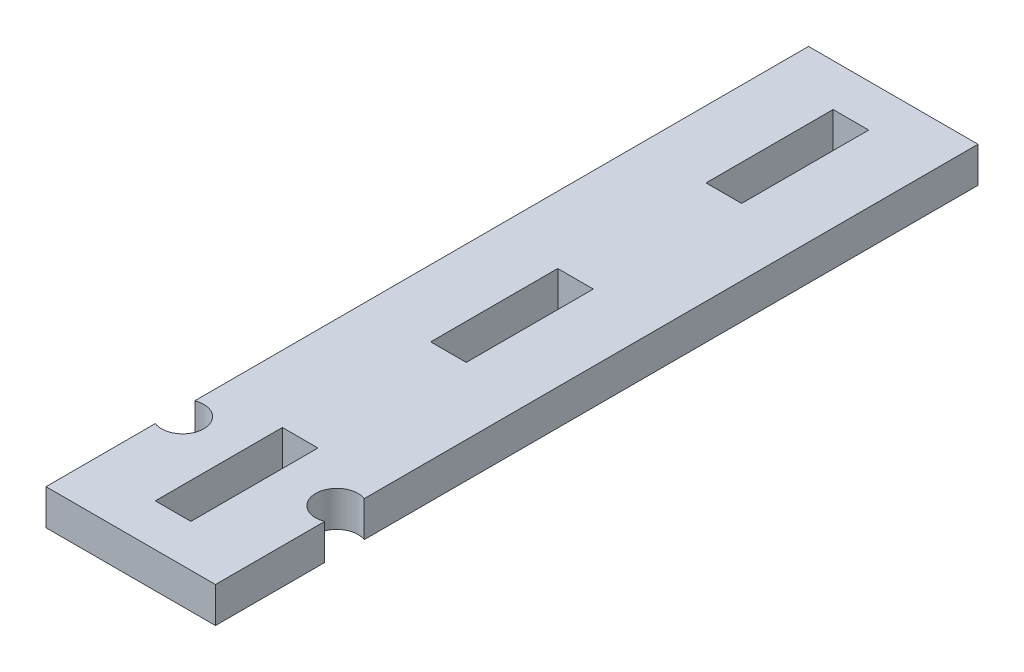
ISO-10303-21;
HEADER;
FILE_DESCRIPTION(('STEP AP214'),'2;1');
FILE_NAME('part.step','',(''),(''),'','','');
FILE_SCHEMA(('AUTOMOTIVE_DESIGN { 1 0 10303 214 1 1 1 1 }'));
ENDSEC;
DATA;
#1=APPLICATION_CONTEXT('core data for automotive mechanical design processes');
#2=APPLICATION_PROTOCOL_DEFINITION('international standard','automotive_design',2000,#1);
#3=PRODUCT_CONTEXT('',#1,'mechanical');
#4=PRODUCT('Part','Part','',(#3));
#5=PRODUCT_RELATED_PRODUCT_CATEGORY('part','',(#4));
#6=PRODUCT_DEFINITION_FORMATION('','',#4);
#7=PRODUCT_DEFINITION_CONTEXT('part definition',#1,'design');
#8=PRODUCT_DEFINITION('design','',#6,#7);
#9=PRODUCT_DEFINITION_SHAPE('','',#8);
#10=(LENGTH_UNIT() NAMED_UNIT(*) SI_UNIT(.MILLI.,.METRE.));
#11=(NAMED_UNIT(*) PLANE_ANGLE_UNIT() SI_UNIT($,.RADIAN.));
#12=(NAMED_UNIT(*) SI_UNIT($,.STERADIAN.) SOLID_ANGLE_UNIT());
#13=UNCERTAINTY_MEASURE_WITH_UNIT(LENGTH_MEASURE(1.E-05),#10,'distance_accuracy_value','');
#14=(GEOMETRIC_REPRESENTATION_CONTEXT(3) GLOBAL_UNCERTAINTY_ASSIGNED_CONTEXT((#13)) GLOBAL_UNIT_ASSIGNED_CONTEXT((#10,
#11,#12)) REPRESENTATION_CONTEXT('',''));
#15=CARTESIAN_POINT('',(0.,0.,0.));
#16=DIRECTION('',(0.,0.,1.));
#17=DIRECTION('',(1.,0.,0.));
#18=AXIS2_PLACEMENT_3D('',#15,#16,#17);
#19=CARTESIAN_POINT('',(25.4,5.334,0.));
#20=DIRECTION('',(-1.,0.,0.));
#21=DIRECTION('',(0.,0.,1.));
#22=AXIS2_PLACEMENT_3D('',#19,#20,#21);
#23=PLANE('',#22);
#24=DIRECTION('',(0.,0.,-1.));
#25=VECTOR('',#24,1.);
#26=CARTESIAN_POINT('',(25.4,5.334,0.));
#27=LINE('',#26,#25);
#28=CARTESIAN_POINT('',(25.4,5.334,-22.2990988577116));
#29=VERTEX_POINT('',#28);
#30=CARTESIAN_POINT('',(25.4,5.334,-114.3));
#31=VERTEX_POINT('',#30);
#32=EDGE_CURVE('E182',#29,#31,#27,.T.);
#33=ORIENTED_EDGE('',*,*,#32,.F.);
#34=DIRECTION('',(0.,-1.,0.));
#35=VECTOR('',#34,1.);
#36=CARTESIAN_POINT('',(25.4,5.334,-22.2990988577116));
#37=LINE('',#36,#35);
#38=CARTESIAN_POINT('',(25.4,0.,-22.2990988577116));
#39=VERTEX_POINT('',#38);
#40=EDGE_CURVE('E170',#29,#39,#37,.T.);
#41=ORIENTED_EDGE('',*,*,#40,.T.);
#42=DIRECTION('',(0.,0.,-1.));
#43=VECTOR('',#42,1.);
#44=CARTESIAN_POINT('',(25.4,0.,0.));
#45=LINE('',#44,#43);
#46=CARTESIAN_POINT('',(25.4,0.,-114.3));
#47=VERTEX_POINT('',#46);
#48=EDGE_CURVE('E205',#39,#47,#45,.T.);
#49=ORIENTED_EDGE('',*,*,#48,.T.);
#50=DIRECTION('',(0.,-1.,0.));
#51=VECTOR('',#50,1.);
#52=CARTESIAN_POINT('',(25.4,5.334,-114.3));
#53=LINE('',#52,#51);
#54=EDGE_CURVE('E188',#31,#47,#53,.T.);
#55=ORIENTED_EDGE('',*,*,#54,.F.);
#56=EDGE_LOOP('',(#33,#41,#49,#55));
#57=FACE_BOUND('',#56,.T.);
#58=ADVANCED_FACE('F36',(#57),#23,.F.);
#59=CARTESIAN_POINT('',(0.,5.334,0.));
#60=DIRECTION('',(1.,0.,0.));
#61=DIRECTION('',(0.,0.,-1.));
#62=AXIS2_PLACEMENT_3D('',#59,#60,#61);
#63=PLANE('',#62);
#64=DIRECTION('',(0.,0.,1.));
#65=VECTOR('',#64,1.);
#66=CARTESIAN_POINT('',(0.,5.334,0.));
#67=LINE('',#66,#65);
#68=CARTESIAN_POINT('',(0.,5.334,-16.3748517325479));
#69=VERTEX_POINT('',#68);
#70=CARTESIAN_POINT('',(0.,5.334,0.));
#71=VERTEX_POINT('',#70);
#72=EDGE_CURVE('E211',#69,#71,#67,.T.);
#73=ORIENTED_EDGE('',*,*,#72,.F.);
#74=DIRECTION('',(0.,-1.,0.));
#75=VECTOR('',#74,1.);
#76=CARTESIAN_POINT('',(0.,5.334,-16.3748517325479));
#77=LINE('',#76,#75);
#78=CARTESIAN_POINT('',(0.,0.,-16.3748517325479));
#79=VERTEX_POINT('',#78);
#80=EDGE_CURVE('E222',#69,#79,#77,.T.);
#81=ORIENTED_EDGE('',*,*,#80,.T.);
#82=DIRECTION('',(0.,0.,1.));
#83=VECTOR('',#82,1.);
#84=CARTESIAN_POINT('',(0.,0.,0.));
#85=LINE('',#84,#83);
#86=CARTESIAN_POINT('',(0.,0.,0.));
#87=VERTEX_POINT('',#86);
#88=EDGE_CURVE('E203',#79,#87,#85,.T.);
#89=ORIENTED_EDGE('',*,*,#88,.T.);
#90=DIRECTION('',(0.,-1.,0.));
#91=VECTOR('',#90,1.);
#92=CARTESIAN_POINT('',(0.,5.334,0.));
#93=LINE('',#92,#91);
#94=EDGE_CURVE('E218',#71,#87,#93,.T.);
#95=ORIENTED_EDGE('',*,*,#94,.F.);
#96=EDGE_LOOP('',(#73,#81,#89,#95));
#97=FACE_BOUND('',#96,.T.);
#98=ADVANCED_FACE('F229',(#97),#63,.F.);
#99=CARTESIAN_POINT('',(0.,0.,-114.3));
#100=VERTEX_POINT('',#99);
#101=CARTESIAN_POINT('',(0.,0.,-22.2990988577108));
#102=VERTEX_POINT('',#101);
#103=EDGE_CURVE('E199',#100,#102,#85,.T.);
#104=ORIENTED_EDGE('',*,*,#103,.T.);
#105=DIRECTION('',(0.,-1.,0.));
#106=VECTOR('',#105,1.);
#107=CARTESIAN_POINT('',(0.,5.334,-22.2990988577108));
#108=LINE('',#107,#106);
#109=CARTESIAN_POINT('',(0.,5.334,-22.2990988577108));
#110=VERTEX_POINT('',#109);
#111=EDGE_CURVE('E58',#102,#110,#108,.F.);
#112=ORIENTED_EDGE('',*,*,#111,.T.);
#113=CARTESIAN_POINT('',(0.,5.334,-114.3));
#114=VERTEX_POINT('',#113);
#115=EDGE_CURVE('E193',#114,#110,#67,.T.);
#116=ORIENTED_EDGE('',*,*,#115,.F.);
#117=DIRECTION('',(0.,-1.,0.));
#118=VECTOR('',#117,1.);
#119=CARTESIAN_POINT('',(0.,5.334,-114.3));
#120=LINE('',#119,#118);
#121=EDGE_CURVE('E198',#114,#100,#120,.T.);
#122=ORIENTED_EDGE('',*,*,#121,.T.);
#123=EDGE_LOOP('',(#104,#112,#116,#122));
#124=FACE_BOUND('',#123,.T.);
#125=ADVANCED_FACE('F38',(#124),#63,.F.);
#126=CARTESIAN_POINT('',(0.,5.334,0.));
#127=DIRECTION('',(0.,0.,-1.));
#128=DIRECTION('',(-1.,0.,0.));
#129=AXIS2_PLACEMENT_3D('',#126,#127,#128);
#130=PLANE('',#129);
#131=DIRECTION('',(1.,0.,0.));
#132=VECTOR('',#131,1.);
#133=CARTESIAN_POINT('',(0.,0.,0.));
#134=LINE('',#133,#132);
#135=CARTESIAN_POINT('',(25.4,0.,0.));
#136=VERTEX_POINT('',#135);
#137=EDGE_CURVE('E202',#87,#136,#134,.T.);
#138=ORIENTED_EDGE('',*,*,#137,.T.);
#139=DIRECTION('',(0.,-1.,0.));
#140=VECTOR('',#139,1.);
#141=CARTESIAN_POINT('',(25.4,5.334,0.));
#142=LINE('',#141,#140);
#143=CARTESIAN_POINT('',(25.4,5.334,0.));
#144=VERTEX_POINT('',#143);
#145=EDGE_CURVE('E215',#144,#136,#142,.T.);
#146=ORIENTED_EDGE('',*,*,#145,.F.);
#147=DIRECTION('',(1.,0.,0.));
#148=VECTOR('',#147,1.);
#149=CARTESIAN_POINT('',(0.,5.334,0.));
#150=LINE('',#149,#148);
#151=EDGE_CURVE('E190',#71,#144,#150,.T.);
#152=ORIENTED_EDGE('',*,*,#151,.F.);
#153=ORIENTED_EDGE('',*,*,#94,.T.);
#154=EDGE_LOOP('',(#138,#146,#152,#153));
#155=FACE_BOUND('',#154,.T.);
#156=ADVANCED_FACE('F258',(#155),#130,.F.);
#157=CARTESIAN_POINT('',(25.4,0.,-16.3748517325489));
#158=VERTEX_POINT('',#157);
#159=EDGE_CURVE('E206',#136,#158,#45,.T.);
#160=ORIENTED_EDGE('',*,*,#159,.T.);
#161=DIRECTION('',(0.,-1.,0.));
#162=VECTOR('',#161,1.);
#163=CARTESIAN_POINT('',(25.4,5.334,-16.3748517325489));
#164=LINE('',#163,#162);
#165=CARTESIAN_POINT('',(25.4,5.334,-16.3748517325489));
#166=VERTEX_POINT('',#165);
#167=EDGE_CURVE('E50',#158,#166,#164,.F.);
#168=ORIENTED_EDGE('',*,*,#167,.T.);
#169=EDGE_CURVE('E185',#144,#166,#27,.T.);
#170=ORIENTED_EDGE('',*,*,#169,.F.);
#171=ORIENTED_EDGE('',*,*,#145,.T.);
#172=EDGE_LOOP('',(#160,#168,#170,#171));
#173=FACE_BOUND('',#172,.T.);
#174=ADVANCED_FACE('F260',(#173),#23,.F.);
#175=CARTESIAN_POINT('',(0.,5.334,-114.3));
#176=DIRECTION('',(0.,0.,1.));
#177=DIRECTION('',(1.,0.,0.));
#178=AXIS2_PLACEMENT_3D('',#175,#176,#177);
#179=PLANE('',#178);
#180=DIRECTION('',(-1.,0.,0.));
#181=VECTOR('',#180,1.);
#182=CARTESIAN_POINT('',(0.,0.,-114.3));
#183=LINE('',#182,#181);
#184=EDGE_CURVE('E209',#47,#100,#183,.T.);
#185=ORIENTED_EDGE('',*,*,#184,.T.);
#186=ORIENTED_EDGE('',*,*,#121,.F.);
#187=DIRECTION('',(-1.,0.,0.));
#188=VECTOR('',#187,1.);
#189=CARTESIAN_POINT('',(0.,5.334,-114.3));
#190=LINE('',#189,#188);
#191=EDGE_CURVE('E192',#31,#114,#190,.T.);
#192=ORIENTED_EDGE('',*,*,#191,.F.);
#193=ORIENTED_EDGE('',*,*,#54,.T.);
#194=EDGE_LOOP('',(#185,#186,#192,#193));
#195=FACE_BOUND('',#194,.T.);
#196=ADVANCED_FACE('F378',(#195),#179,.F.);
#197=CARTESIAN_POINT('',(0.,5.334,0.));
#198=DIRECTION('',(0.,-1.,0.));
#199=DIRECTION('',(0.,0.,-1.));
#200=AXIS2_PLACEMENT_3D('',#197,#198,#199);
#201=PLANE('',#200);
#202=DIRECTION('',(1.,0.,0.));
#203=VECTOR('',#202,1.);
#204=CARTESIAN_POINT('',(10.0329999999915,5.334,-25.4000000000032));
#205=LINE('',#204,#203);
#206=CARTESIAN_POINT('',(10.0329999999915,5.334,-25.4000000000032));
#207=VERTEX_POINT('',#206);
#208=CARTESIAN_POINT('',(15.3669999999915,5.334,-25.4000000000032));
#209=VERTEX_POINT('',#208);
#210=EDGE_CURVE('E275',#207,#209,#205,.T.);
#211=ORIENTED_EDGE('',*,*,#210,.T.);
#212=DIRECTION('',(0.,0.,1.));
#213=VECTOR('',#212,1.);
#214=CARTESIAN_POINT('',(15.3669999999915,5.334,-25.4000000000032));
#215=LINE('',#214,#213);
#216=CARTESIAN_POINT('',(15.3669999999914,5.334,-6.35000000000316));
#217=VERTEX_POINT('',#216);
#218=EDGE_CURVE('E265',#209,#217,#215,.T.);
#219=ORIENTED_EDGE('',*,*,#218,.T.);
#220=DIRECTION('',(-1.,0.,0.));
#221=VECTOR('',#220,1.);
#222=CARTESIAN_POINT('',(15.3669999999914,5.334,-6.35000000000316));
#223=LINE('',#222,#221);
#224=CARTESIAN_POINT('',(10.0329999999914,5.334,-6.35000000000317));
#225=VERTEX_POINT('',#224);
#226=EDGE_CURVE('E268',#217,#225,#223,.T.);
#227=ORIENTED_EDGE('',*,*,#226,.T.);
#228=DIRECTION('',(0.,0.,-1.));
#229=VECTOR('',#228,1.);
#230=CARTESIAN_POINT('',(10.0329999999914,5.334,-6.35000000000317));
#231=LINE('',#230,#229);
#232=EDGE_CURVE('E272',#225,#207,#231,.T.);
#233=ORIENTED_EDGE('',*,*,#232,.T.);
#234=EDGE_LOOP('',(#211,#219,#227,#233));
#235=FACE_BOUND('',#234,.T.);
#236=DIRECTION('',(-1.,0.,0.));
#237=VECTOR('',#236,1.);
#238=CARTESIAN_POINT('',(15.3669999999916,5.334,-47.6250000000032));
#239=LINE('',#238,#237);
#240=CARTESIAN_POINT('',(15.3669999999916,5.334,-47.6250000000032));
#241=VERTEX_POINT('',#240);
#242=CARTESIAN_POINT('',(10.0329999999916,5.334,-47.6250000000032));
#243=VERTEX_POINT('',#242);
#244=EDGE_CURVE('E307',#241,#243,#239,.T.);
#245=ORIENTED_EDGE('',*,*,#244,.T.);
#246=DIRECTION('',(0.,0.,-1.));
#247=VECTOR('',#246,1.);
#248=CARTESIAN_POINT('',(10.0329999999916,5.334,-47.6250000000032));
#249=LINE('',#248,#247);
#250=CARTESIAN_POINT('',(10.0329999999917,5.334,-66.6750000000032));
#251=VERTEX_POINT('',#250);
#252=EDGE_CURVE('E297',#243,#251,#249,.T.);
#253=ORIENTED_EDGE('',*,*,#252,.T.);
#254=DIRECTION('',(1.,0.,0.));
#255=VECTOR('',#254,1.);
#256=CARTESIAN_POINT('',(10.0329999999917,5.334,-66.6750000000032));
#257=LINE('',#256,#255);
#258=CARTESIAN_POINT('',(15.3669999999917,5.334,-66.6750000000032));
#259=VERTEX_POINT('',#258);
#260=EDGE_CURVE('E300',#251,#259,#257,.T.);
#261=ORIENTED_EDGE('',*,*,#260,.T.);
#262=DIRECTION('',(0.,0.,1.));
#263=VECTOR('',#262,1.);
#264=CARTESIAN_POINT('',(15.3669999999917,5.334,-66.6750000000032));
#265=LINE('',#264,#263);
#266=EDGE_CURVE('E304',#259,#241,#265,.T.);
#267=ORIENTED_EDGE('',*,*,#266,.T.);
#268=EDGE_LOOP('',(#245,#253,#261,#267));
#269=FACE_BOUND('',#268,.T.);
#270=DIRECTION('',(-1.,0.,0.));
#271=VECTOR('',#270,1.);
#272=CARTESIAN_POINT('',(15.3669999999917,5.334,-88.9000000000032));
#273=LINE('',#272,#271);
#274=CARTESIAN_POINT('',(15.3669999999917,5.334,-88.9000000000032));
#275=VERTEX_POINT('',#274);
#276=CARTESIAN_POINT('',(10.0329999999917,5.334,-88.9000000000032));
#277=VERTEX_POINT('',#276);
#278=EDGE_CURVE('E252',#275,#277,#273,.T.);
#279=ORIENTED_EDGE('',*,*,#278,.T.);
#280=DIRECTION('',(0.,0.,-1.));
#281=VECTOR('',#280,1.);
#282=CARTESIAN_POINT('',(10.0329999999917,5.334,-88.9000000000032));
#283=LINE('',#282,#281);
#284=CARTESIAN_POINT('',(10.0329999999918,5.334,-107.950000000003));
#285=VERTEX_POINT('',#284);
#286=EDGE_CURVE('E329',#277,#285,#283,.T.);
#287=ORIENTED_EDGE('',*,*,#286,.T.);
#288=DIRECTION('',(1.,0.,0.));
#289=VECTOR('',#288,1.);
#290=CARTESIAN_POINT('',(10.0329999999918,5.334,-107.950000000003));
#291=LINE('',#290,#289);
#292=CARTESIAN_POINT('',(15.3669999999918,5.334,-107.950000000003));
#293=VERTEX_POINT('',#292);
#294=EDGE_CURVE('E332',#285,#293,#291,.T.);
#295=ORIENTED_EDGE('',*,*,#294,.T.);
#296=DIRECTION('',(0.,0.,1.));
#297=VECTOR('',#296,1.);
#298=CARTESIAN_POINT('',(15.3669999999918,5.334,-107.950000000003));
#299=LINE('',#298,#297);
#300=EDGE_CURVE('E335',#293,#275,#299,.T.);
#301=ORIENTED_EDGE('',*,*,#300,.T.);
#302=EDGE_LOOP('',(#279,#287,#295,#301));
#303=FACE_BOUND('',#302,.T.);
#304=ORIENTED_EDGE('',*,*,#169,.T.);
#305=CARTESIAN_POINT('',(24.2569999999998,5.334,-19.3369752951302));
#306=DIRECTION('',(0.,-1.,0.));
#307=DIRECTION('',(0.,0.,-1.));
#308=AXIS2_PLACEMENT_3D('',#305,#306,#307);
#309=CIRCLE('',#308,3.175);
#310=EDGE_CURVE('E173',#166,#29,#309,.T.);
#311=ORIENTED_EDGE('',*,*,#310,.T.);
#312=ORIENTED_EDGE('',*,*,#32,.T.);
#313=ORIENTED_EDGE('',*,*,#191,.T.);
#314=ORIENTED_EDGE('',*,*,#115,.T.);
#315=CARTESIAN_POINT('',(1.14299999999988,5.334,-19.3369752951293));
#316=DIRECTION('',(0.,-1.,0.));
#317=DIRECTION('',(0.,0.,1.));
#318=AXIS2_PLACEMENT_3D('',#315,#316,#317);
#319=CIRCLE('',#318,3.175);
#320=EDGE_CURVE('E177',#110,#69,#319,.T.);
#321=ORIENTED_EDGE('',*,*,#320,.T.);
#322=ORIENTED_EDGE('',*,*,#72,.T.);
#323=ORIENTED_EDGE('',*,*,#151,.T.);
#324=EDGE_LOOP('',(#304,#311,#312,#313,#314,#321,#322,#323));
#325=FACE_BOUND('',#324,.T.);
#326=ADVANCED_FACE('F181',(#235,#269,#303,#325),#201,.F.);
#327=CARTESIAN_POINT('',(0.,0.,0.));
#328=DIRECTION('',(0.,-1.,0.));
#329=DIRECTION('',(0.,0.,-1.));
#330=AXIS2_PLACEMENT_3D('',#327,#328,#329);
#331=PLANE('',#330);
#332=CARTESIAN_POINT('',(24.2569999999998,0.,-19.3369752951302));
#333=DIRECTION('',(0.,-1.,0.));
#334=DIRECTION('',(0.,0.,-1.));
#335=AXIS2_PLACEMENT_3D('',#332,#333,#334);
#336=CIRCLE('',#335,3.175);
#337=EDGE_CURVE('E12',#158,#39,#336,.T.);
#338=ORIENTED_EDGE('',*,*,#337,.F.);
#339=ORIENTED_EDGE('',*,*,#159,.F.);
#340=ORIENTED_EDGE('',*,*,#137,.F.);
#341=ORIENTED_EDGE('',*,*,#88,.F.);
#342=CARTESIAN_POINT('',(1.14299999999988,0.,-19.3369752951293));
#343=DIRECTION('',(0.,-1.,0.));
#344=DIRECTION('',(0.,0.,-1.));
#345=AXIS2_PLACEMENT_3D('',#342,#343,#344);
#346=CIRCLE('',#345,3.175);
#347=EDGE_CURVE('E44',#102,#79,#346,.T.);
#348=ORIENTED_EDGE('',*,*,#347,.F.);
#349=ORIENTED_EDGE('',*,*,#103,.F.);
#350=ORIENTED_EDGE('',*,*,#184,.F.);
#351=ORIENTED_EDGE('',*,*,#48,.F.);
#352=EDGE_LOOP('',(#338,#339,#340,#341,#348,#349,#350,#351));
#353=FACE_BOUND('',#352,.T.);
#354=DIRECTION('',(0.,0.,1.));
#355=VECTOR('',#354,1.);
#356=CARTESIAN_POINT('',(15.3669999999915,0.,-25.4000000000032));
#357=LINE('',#356,#355);
#358=CARTESIAN_POINT('',(15.3669999999915,0.,-25.4000000000032));
#359=VERTEX_POINT('',#358);
#360=CARTESIAN_POINT('',(15.3669999999914,0.,-6.35000000000316));
#361=VERTEX_POINT('',#360);
#362=EDGE_CURVE('E232',#359,#361,#357,.T.);
#363=ORIENTED_EDGE('',*,*,#362,.F.);
#364=DIRECTION('',(1.,0.,0.));
#365=VECTOR('',#364,1.);
#366=CARTESIAN_POINT('',(10.0329999999915,0.,-25.4000000000032));
#367=LINE('',#366,#365);
#368=CARTESIAN_POINT('',(10.0329999999915,0.,-25.4000000000032));
#369=VERTEX_POINT('',#368);
#370=EDGE_CURVE('E269',#369,#359,#367,.T.);
#371=ORIENTED_EDGE('',*,*,#370,.F.);
#372=DIRECTION('',(0.,0.,-1.));
#373=VECTOR('',#372,1.);
#374=CARTESIAN_POINT('',(10.0329999999914,0.,-6.35000000000317));
#375=LINE('',#374,#373);
#376=CARTESIAN_POINT('',(10.0329999999914,0.,-6.35000000000317));
#377=VERTEX_POINT('',#376);
#378=EDGE_CURVE('E283',#377,#369,#375,.T.);
#379=ORIENTED_EDGE('',*,*,#378,.F.);
#380=DIRECTION('',(-1.,0.,0.));
#381=VECTOR('',#380,1.);
#382=CARTESIAN_POINT('',(15.3669999999914,0.,-6.35000000000316));
#383=LINE('',#382,#381);
#384=EDGE_CURVE('E280',#361,#377,#383,.T.);
#385=ORIENTED_EDGE('',*,*,#384,.F.);
#386=EDGE_LOOP('',(#363,#371,#379,#385));
#387=FACE_BOUND('',#386,.T.);
#388=DIRECTION('',(0.,0.,-1.));
#389=VECTOR('',#388,1.);
#390=CARTESIAN_POINT('',(10.0329999999916,0.,-47.6250000000032));
#391=LINE('',#390,#389);
#392=CARTESIAN_POINT('',(10.0329999999916,0.,-47.6250000000032));
#393=VERTEX_POINT('',#392);
#394=CARTESIAN_POINT('',(10.0329999999917,0.,-66.6750000000032));
#395=VERTEX_POINT('',#394);
#396=EDGE_CURVE('E290',#393,#395,#391,.T.);
#397=ORIENTED_EDGE('',*,*,#396,.F.);
#398=DIRECTION('',(-1.,0.,0.));
#399=VECTOR('',#398,1.);
#400=CARTESIAN_POINT('',(15.3669999999916,0.,-47.6250000000032));
#401=LINE('',#400,#399);
#402=CARTESIAN_POINT('',(15.3669999999916,0.,-47.6250000000032));
#403=VERTEX_POINT('',#402);
#404=EDGE_CURVE('E301',#403,#393,#401,.T.);
#405=ORIENTED_EDGE('',*,*,#404,.F.);
#406=DIRECTION('',(0.,0.,1.));
#407=VECTOR('',#406,1.);
#408=CARTESIAN_POINT('',(15.3669999999917,0.,-66.6750000000032));
#409=LINE('',#408,#407);
#410=CARTESIAN_POINT('',(15.3669999999917,0.,-66.6750000000032));
#411=VERTEX_POINT('',#410);
#412=EDGE_CURVE('E315',#411,#403,#409,.T.);
#413=ORIENTED_EDGE('',*,*,#412,.F.);
#414=DIRECTION('',(1.,0.,0.));
#415=VECTOR('',#414,1.);
#416=CARTESIAN_POINT('',(10.0329999999917,0.,-66.6750000000032));
#417=LINE('',#416,#415);
#418=EDGE_CURVE('E312',#395,#411,#417,.T.);
#419=ORIENTED_EDGE('',*,*,#418,.F.);
#420=EDGE_LOOP('',(#397,#405,#413,#419));
#421=FACE_BOUND('',#420,.T.);
#422=DIRECTION('',(0.,0.,-1.));
#423=VECTOR('',#422,1.);
#424=CARTESIAN_POINT('',(10.0329999999917,0.,-88.9000000000032));
#425=LINE('',#424,#423);
#426=CARTESIAN_POINT('',(10.0329999999917,0.,-88.9000000000032));
#427=VERTEX_POINT('',#426);
#428=CARTESIAN_POINT('',(10.0329999999918,0.,-107.950000000003));
#429=VERTEX_POINT('',#428);
#430=EDGE_CURVE('E322',#427,#429,#425,.T.);
#431=ORIENTED_EDGE('',*,*,#430,.F.);
#432=DIRECTION('',(-1.,0.,0.));
#433=VECTOR('',#432,1.);
#434=CARTESIAN_POINT('',(15.3669999999917,0.,-88.9000000000032));
#435=LINE('',#434,#433);
#436=CARTESIAN_POINT('',(15.3669999999917,0.,-88.9000000000032));
#437=VERTEX_POINT('',#436);
#438=EDGE_CURVE('E246',#437,#427,#435,.T.);
#439=ORIENTED_EDGE('',*,*,#438,.F.);
#440=DIRECTION('',(0.,0.,1.));
#441=VECTOR('',#440,1.);
#442=CARTESIAN_POINT('',(15.3669999999918,0.,-107.950000000003));
#443=LINE('',#442,#441);
#444=CARTESIAN_POINT('',(15.3669999999918,0.,-107.950000000003));
#445=VERTEX_POINT('',#444);
#446=EDGE_CURVE('E343',#445,#437,#443,.T.);
#447=ORIENTED_EDGE('',*,*,#446,.F.);
#448=DIRECTION('',(1.,0.,0.));
#449=VECTOR('',#448,1.);
#450=CARTESIAN_POINT('',(10.0329999999918,0.,-107.950000000003));
#451=LINE('',#450,#449);
#452=EDGE_CURVE('E341',#429,#445,#451,.T.);
#453=ORIENTED_EDGE('',*,*,#452,.F.);
#454=EDGE_LOOP('',(#431,#439,#447,#453));
#455=FACE_BOUND('',#454,.T.);
#456=ADVANCED_FACE('F234',(#353,#387,#421,#455),#331,.T.);
#457=CARTESIAN_POINT('',(10.0329999999917,5.334,-88.9000000000032));
#458=DIRECTION('',(-1.,0.,0.));
#459=DIRECTION('',(0.,0.,1.));
#460=AXIS2_PLACEMENT_3D('',#457,#458,#459);
#461=PLANE('',#460);
#462=ORIENTED_EDGE('',*,*,#430,.T.);
#463=DIRECTION('',(0.,-1.,0.));
#464=VECTOR('',#463,1.);
#465=CARTESIAN_POINT('',(10.0329999999918,5.334,-107.950000000003));
#466=LINE('',#465,#464);
#467=EDGE_CURVE('E250',#285,#429,#466,.T.);
#468=ORIENTED_EDGE('',*,*,#467,.F.);
#469=ORIENTED_EDGE('',*,*,#286,.F.);
#470=DIRECTION('',(0.,-1.,0.));
#471=VECTOR('',#470,1.);
#472=CARTESIAN_POINT('',(10.0329999999917,5.334,-88.9000000000032));
#473=LINE('',#472,#471);
#474=EDGE_CURVE('E237',#277,#427,#473,.T.);
#475=ORIENTED_EDGE('',*,*,#474,.T.);
#476=EDGE_LOOP('',(#462,#468,#469,#475));
#477=FACE_BOUND('',#476,.T.);
#478=ADVANCED_FACE('F354',(#477),#461,.F.);
#479=CARTESIAN_POINT('',(15.3669999999917,5.334,-88.9000000000032));
#480=DIRECTION('',(0.,0.,1.));
#481=DIRECTION('',(1.,0.,0.));
#482=AXIS2_PLACEMENT_3D('',#479,#480,#481);
#483=PLANE('',#482);
#484=ORIENTED_EDGE('',*,*,#438,.T.);
#485=ORIENTED_EDGE('',*,*,#474,.F.);
#486=ORIENTED_EDGE('',*,*,#278,.F.);
#487=DIRECTION('',(0.,-1.,0.));
#488=VECTOR('',#487,1.);
#489=CARTESIAN_POINT('',(15.3669999999917,5.334,-88.9000000000032));
#490=LINE('',#489,#488);
#491=EDGE_CURVE('E238',#275,#437,#490,.T.);
#492=ORIENTED_EDGE('',*,*,#491,.T.);
#493=EDGE_LOOP('',(#484,#485,#486,#492));
#494=FACE_BOUND('',#493,.T.);
#495=ADVANCED_FACE('F350',(#494),#483,.F.);
#496=CARTESIAN_POINT('',(15.3669999999918,5.334,-107.950000000003));
#497=DIRECTION('',(1.,0.,0.));
#498=DIRECTION('',(0.,0.,-1.));
#499=AXIS2_PLACEMENT_3D('',#496,#497,#498);
#500=PLANE('',#499);
#501=ORIENTED_EDGE('',*,*,#446,.T.);
#502=ORIENTED_EDGE('',*,*,#491,.F.);
#503=ORIENTED_EDGE('',*,*,#300,.F.);
#504=DIRECTION('',(0.,-1.,0.));
#505=VECTOR('',#504,1.);
#506=CARTESIAN_POINT('',(15.3669999999918,5.334,-107.950000000003));
#507=LINE('',#506,#505);
#508=EDGE_CURVE('E243',#293,#445,#507,.T.);
#509=ORIENTED_EDGE('',*,*,#508,.T.);
#510=EDGE_LOOP('',(#501,#502,#503,#509));
#511=FACE_BOUND('',#510,.T.);
#512=ADVANCED_FACE('F360',(#511),#500,.F.);
#513=CARTESIAN_POINT('',(10.0329999999918,5.334,-107.950000000003));
#514=DIRECTION('',(0.,0.,-1.));
#515=DIRECTION('',(-1.,0.,0.));
#516=AXIS2_PLACEMENT_3D('',#513,#514,#515);
#517=PLANE('',#516);
#518=ORIENTED_EDGE('',*,*,#452,.T.);
#519=ORIENTED_EDGE('',*,*,#508,.F.);
#520=ORIENTED_EDGE('',*,*,#294,.F.);
#521=ORIENTED_EDGE('',*,*,#467,.T.);
#522=EDGE_LOOP('',(#518,#519,#520,#521));
#523=FACE_BOUND('',#522,.T.);
#524=ADVANCED_FACE('F357',(#523),#517,.F.);
#525=CARTESIAN_POINT('',(10.0329999999916,5.334,-47.6250000000032));
#526=DIRECTION('',(-1.,0.,0.));
#527=DIRECTION('',(0.,0.,1.));
#528=AXIS2_PLACEMENT_3D('',#525,#526,#527);
#529=PLANE('',#528);
#530=ORIENTED_EDGE('',*,*,#396,.T.);
#531=DIRECTION('',(0.,-1.,0.));
#532=VECTOR('',#531,1.);
#533=CARTESIAN_POINT('',(10.0329999999917,5.334,-66.6750000000032));
#534=LINE('',#533,#532);
#535=EDGE_CURVE('E310',#251,#395,#534,.T.);
#536=ORIENTED_EDGE('',*,*,#535,.F.);
#537=ORIENTED_EDGE('',*,*,#252,.F.);
#538=DIRECTION('',(0.,-1.,0.));
#539=VECTOR('',#538,1.);
#540=CARTESIAN_POINT('',(10.0329999999916,5.334,-47.6250000000032));
#541=LINE('',#540,#539);
#542=EDGE_CURVE('E320',#243,#393,#541,.T.);
#543=ORIENTED_EDGE('',*,*,#542,.T.);
#544=EDGE_LOOP('',(#530,#536,#537,#543));
#545=FACE_BOUND('',#544,.T.);
#546=ADVANCED_FACE('F367',(#545),#529,.F.);
#547=CARTESIAN_POINT('',(15.3669999999916,5.334,-47.6250000000032));
#548=DIRECTION('',(0.,0.,1.));
#549=DIRECTION('',(1.,0.,0.));
#550=AXIS2_PLACEMENT_3D('',#547,#548,#549);
#551=PLANE('',#550);
#552=ORIENTED_EDGE('',*,*,#404,.T.);
#553=ORIENTED_EDGE('',*,*,#542,.F.);
#554=ORIENTED_EDGE('',*,*,#244,.F.);
#555=DIRECTION('',(0.,-1.,0.));
#556=VECTOR('',#555,1.);
#557=CARTESIAN_POINT('',(15.3669999999916,5.334,-47.6250000000032));
#558=LINE('',#557,#556);
#559=EDGE_CURVE('E323',#241,#403,#558,.T.);
#560=ORIENTED_EDGE('',*,*,#559,.T.);
#561=EDGE_LOOP('',(#552,#553,#554,#560));
#562=FACE_BOUND('',#561,.T.);
#563=ADVANCED_FACE('F476',(#562),#551,.F.);
#564=CARTESIAN_POINT('',(15.3669999999917,5.334,-66.6750000000032));
#565=DIRECTION('',(1.,0.,0.));
#566=DIRECTION('',(0.,0.,-1.));
#567=AXIS2_PLACEMENT_3D('',#564,#565,#566);
#568=PLANE('',#567);
#569=ORIENTED_EDGE('',*,*,#412,.T.);
#570=ORIENTED_EDGE('',*,*,#559,.F.);
#571=ORIENTED_EDGE('',*,*,#266,.F.);
#572=DIRECTION('',(0.,-1.,0.));
#573=VECTOR('',#572,1.);
#574=CARTESIAN_POINT('',(15.3669999999917,5.334,-66.6750000000032));
#575=LINE('',#574,#573);
#576=EDGE_CURVE('E325',#259,#411,#575,.T.);
#577=ORIENTED_EDGE('',*,*,#576,.T.);
#578=EDGE_LOOP('',(#569,#570,#571,#577));
#579=FACE_BOUND('',#578,.T.);
#580=ADVANCED_FACE('F486',(#579),#568,.F.);
#581=CARTESIAN_POINT('',(10.0329999999917,5.334,-66.6750000000032));
#582=DIRECTION('',(0.,0.,-1.));
#583=DIRECTION('',(-1.,0.,0.));
#584=AXIS2_PLACEMENT_3D('',#581,#582,#583);
#585=PLANE('',#584);
#586=ORIENTED_EDGE('',*,*,#418,.T.);
#587=ORIENTED_EDGE('',*,*,#576,.F.);
#588=ORIENTED_EDGE('',*,*,#260,.F.);
#589=ORIENTED_EDGE('',*,*,#535,.T.);
#590=EDGE_LOOP('',(#586,#587,#588,#589));
#591=FACE_BOUND('',#590,.T.);
#592=ADVANCED_FACE('F496',(#591),#585,.F.);
#593=CARTESIAN_POINT('',(15.3669999999915,5.334,-25.4000000000032));
#594=DIRECTION('',(1.,0.,0.));
#595=DIRECTION('',(0.,0.,-1.));
#596=AXIS2_PLACEMENT_3D('',#593,#594,#595);
#597=PLANE('',#596);
#598=ORIENTED_EDGE('',*,*,#362,.T.);
#599=DIRECTION('',(0.,-1.,0.));
#600=VECTOR('',#599,1.);
#601=CARTESIAN_POINT('',(15.3669999999914,5.334,-6.35000000000316));
#602=LINE('',#601,#600);
#603=EDGE_CURVE('E278',#217,#361,#602,.T.);
#604=ORIENTED_EDGE('',*,*,#603,.F.);
#605=ORIENTED_EDGE('',*,*,#218,.F.);
#606=DIRECTION('',(0.,-1.,0.));
#607=VECTOR('',#606,1.);
#608=CARTESIAN_POINT('',(15.3669999999915,5.334,-25.4000000000032));
#609=LINE('',#608,#607);
#610=EDGE_CURVE('E288',#209,#359,#609,.T.);
#611=ORIENTED_EDGE('',*,*,#610,.T.);
#612=EDGE_LOOP('',(#598,#604,#605,#611));
#613=FACE_BOUND('',#612,.T.);
#614=ADVANCED_FACE('F506',(#613),#597,.F.);
#615=CARTESIAN_POINT('',(10.0329999999915,5.334,-25.4000000000032));
#616=DIRECTION('',(0.,0.,-1.));
#617=DIRECTION('',(-1.,0.,0.));
#618=AXIS2_PLACEMENT_3D('',#615,#616,#617);
#619=PLANE('',#618);
#620=ORIENTED_EDGE('',*,*,#370,.T.);
#621=ORIENTED_EDGE('',*,*,#610,.F.);
#622=ORIENTED_EDGE('',*,*,#210,.F.);
#623=DIRECTION('',(0.,-1.,0.));
#624=VECTOR('',#623,1.);
#625=CARTESIAN_POINT('',(10.0329999999915,5.334,-25.4000000000032));
#626=LINE('',#625,#624);
#627=EDGE_CURVE('E291',#207,#369,#626,.T.);
#628=ORIENTED_EDGE('',*,*,#627,.T.);
#629=EDGE_LOOP('',(#620,#621,#622,#628));
#630=FACE_BOUND('',#629,.T.);
#631=ADVANCED_FACE('F516',(#630),#619,.F.);
#632=CARTESIAN_POINT('',(10.0329999999914,5.334,-6.35000000000317));
#633=DIRECTION('',(-1.,0.,0.));
#634=DIRECTION('',(0.,0.,1.));
#635=AXIS2_PLACEMENT_3D('',#632,#633,#634);
#636=PLANE('',#635);
#637=ORIENTED_EDGE('',*,*,#378,.T.);
#638=ORIENTED_EDGE('',*,*,#627,.F.);
#639=ORIENTED_EDGE('',*,*,#232,.F.);
#640=DIRECTION('',(0.,-1.,0.));
#641=VECTOR('',#640,1.);
#642=CARTESIAN_POINT('',(10.0329999999914,5.334,-6.35000000000317));
#643=LINE('',#642,#641);
#644=EDGE_CURVE('E293',#225,#377,#643,.T.);
#645=ORIENTED_EDGE('',*,*,#644,.T.);
#646=EDGE_LOOP('',(#637,#638,#639,#645));
#647=FACE_BOUND('',#646,.T.);
#648=ADVANCED_FACE('F526',(#647),#636,.F.);
#649=CARTESIAN_POINT('',(15.3669999999914,5.334,-6.35000000000316));
#650=DIRECTION('',(0.,0.,1.));
#651=DIRECTION('',(1.,0.,0.));
#652=AXIS2_PLACEMENT_3D('',#649,#650,#651);
#653=PLANE('',#652);
#654=ORIENTED_EDGE('',*,*,#384,.T.);
#655=ORIENTED_EDGE('',*,*,#644,.F.);
#656=ORIENTED_EDGE('',*,*,#226,.F.);
#657=ORIENTED_EDGE('',*,*,#603,.T.);
#658=EDGE_LOOP('',(#654,#655,#656,#657));
#659=FACE_BOUND('',#658,.T.);
#660=ADVANCED_FACE('F401',(#659),#653,.F.);
#661=CARTESIAN_POINT('',(1.14299999999988,5.334,-19.3369752951293));
#662=DIRECTION('',(0.,-1.,0.));
#663=DIRECTION('',(0.,0.,-1.));
#664=AXIS2_PLACEMENT_3D('',#661,#662,#663);
#665=CYLINDRICAL_SURFACE('',#664,3.175);
#666=ORIENTED_EDGE('',*,*,#320,.F.);
#667=ORIENTED_EDGE('',*,*,#111,.F.);
#668=ORIENTED_EDGE('',*,*,#347,.T.);
#669=ORIENTED_EDGE('',*,*,#80,.F.);
#670=EDGE_LOOP('',(#666,#667,#668,#669));
#671=FACE_BOUND('',#670,.T.);
#672=ADVANCED_FACE('F221',(#671),#665,.F.);
#673=CARTESIAN_POINT('',(24.2569999999998,5.334,-19.3369752951302));
#674=DIRECTION('',(0.,-1.,0.));
#675=DIRECTION('',(0.,0.,-1.));
#676=AXIS2_PLACEMENT_3D('',#673,#674,#675);
#677=CYLINDRICAL_SURFACE('',#676,3.175);
#678=ORIENTED_EDGE('',*,*,#310,.F.);
#679=ORIENTED_EDGE('',*,*,#167,.F.);
#680=ORIENTED_EDGE('',*,*,#337,.T.);
#681=ORIENTED_EDGE('',*,*,#40,.F.);
#682=EDGE_LOOP('',(#678,#679,#680,#681));
#683=FACE_BOUND('',#682,.T.);
#684=ADVANCED_FACE('F172',(#683),#677,.F.);
#685=CLOSED_SHELL('',(#58,#98,#125,#156,#174,#196,#326,#456,#478,#495,#512,#524,#546,#563,#580,
#592,#614,#631,#648,#660,#672,#684));
#686=MANIFOLD_SOLID_BREP('B2',#685);
#687=ADVANCED_BREP_SHAPE_REPRESENTATION('',(#18,#686),#14);
#688=SHAPE_DEFINITION_REPRESENTATION(#9,#687);
ENDSEC;
END-ISO-10303-21;
